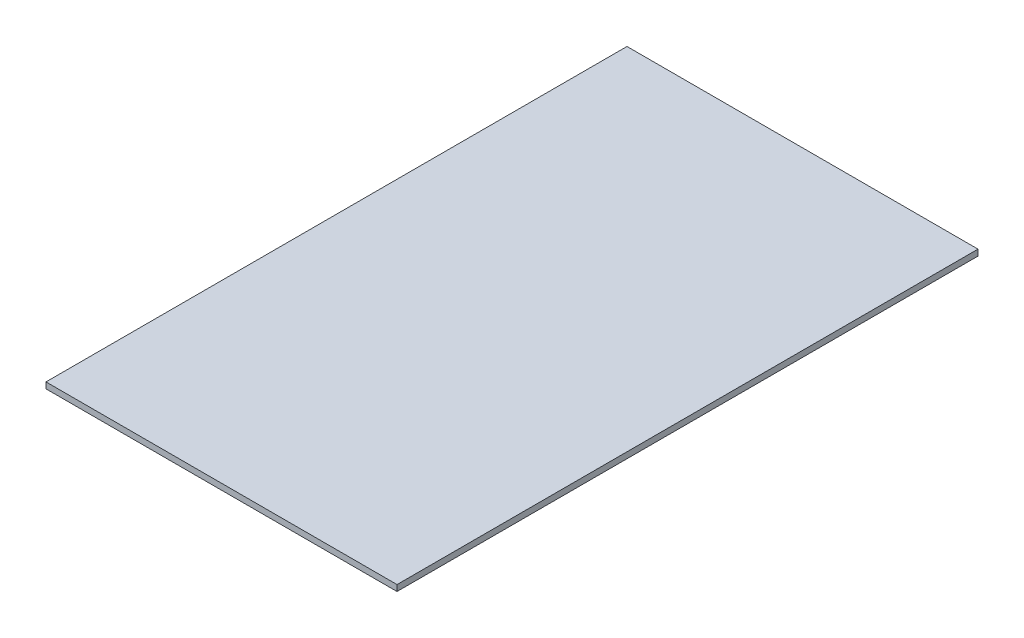
ISO-10303-21;
HEADER;
FILE_DESCRIPTION(('STEP AP214'),'2;1');
FILE_NAME('part.step','',(''),(''),'','','');
FILE_SCHEMA(('AUTOMOTIVE_DESIGN { 1 0 10303 214 1 1 1 1 }'));
ENDSEC;
DATA;
#1=APPLICATION_CONTEXT('core data for automotive mechanical design processes');
#2=APPLICATION_PROTOCOL_DEFINITION('international standard','automotive_design',2000,#1);
#3=PRODUCT_CONTEXT('',#1,'mechanical');
#4=PRODUCT('Part','Part','',(#3));
#5=PRODUCT_RELATED_PRODUCT_CATEGORY('part','',(#4));
#6=PRODUCT_DEFINITION_FORMATION('','',#4);
#7=PRODUCT_DEFINITION_CONTEXT('part definition',#1,'design');
#8=PRODUCT_DEFINITION('design','',#6,#7);
#9=PRODUCT_DEFINITION_SHAPE('','',#8);
#10=(LENGTH_UNIT() NAMED_UNIT(*) SI_UNIT(.MILLI.,.METRE.));
#11=(NAMED_UNIT(*) PLANE_ANGLE_UNIT() SI_UNIT($,.RADIAN.));
#12=(NAMED_UNIT(*) SI_UNIT($,.STERADIAN.) SOLID_ANGLE_UNIT());
#13=UNCERTAINTY_MEASURE_WITH_UNIT(LENGTH_MEASURE(1.E-05),#10,'distance_accuracy_value','');
#14=(GEOMETRIC_REPRESENTATION_CONTEXT(3) GLOBAL_UNCERTAINTY_ASSIGNED_CONTEXT((#13)) GLOBAL_UNIT_ASSIGNED_CONTEXT((#10,
#11,#12)) REPRESENTATION_CONTEXT('',''));
#15=CARTESIAN_POINT('',(0.,0.,0.));
#16=DIRECTION('',(0.,0.,1.));
#17=DIRECTION('',(1.,0.,0.));
#18=AXIS2_PLACEMENT_3D('',#15,#16,#17);
#19=CARTESIAN_POINT('',(0.,3.175,0.));
#20=DIRECTION('',(1.,0.,0.));
#21=DIRECTION('',(0.,0.,-1.));
#22=AXIS2_PLACEMENT_3D('',#19,#20,#21);
#23=PLANE('',#22);
#24=DIRECTION('',(0.,0.,1.));
#25=VECTOR('',#24,1.);
#26=CARTESIAN_POINT('',(0.,0.,0.));
#27=LINE('',#26,#25);
#28=CARTESIAN_POINT('',(0.,0.,-304.8));
#29=VERTEX_POINT('',#28);
#30=CARTESIAN_POINT('',(0.,0.,0.));
#31=VERTEX_POINT('',#30);
#32=EDGE_CURVE('E95',#29,#31,#27,.T.);
#33=ORIENTED_EDGE('',*,*,#32,.T.);
#34=DIRECTION('',(0.,-1.,0.));
#35=VECTOR('',#34,1.);
#36=CARTESIAN_POINT('',(0.,3.175,0.));
#37=LINE('',#36,#35);
#38=CARTESIAN_POINT('',(0.,3.175,0.));
#39=VERTEX_POINT('',#38);
#40=EDGE_CURVE('E11',#39,#31,#37,.T.);
#41=ORIENTED_EDGE('',*,*,#40,.F.);
#42=DIRECTION('',(0.,0.,1.));
#43=VECTOR('',#42,1.);
#44=CARTESIAN_POINT('',(0.,3.175,0.));
#45=LINE('',#44,#43);
#46=CARTESIAN_POINT('',(0.,3.175,-304.8));
#47=VERTEX_POINT('',#46);
#48=EDGE_CURVE('E83',#47,#39,#45,.T.);
#49=ORIENTED_EDGE('',*,*,#48,.F.);
#50=DIRECTION('',(0.,-1.,0.));
#51=VECTOR('',#50,1.);
#52=CARTESIAN_POINT('',(0.,3.175,-304.8));
#53=LINE('',#52,#51);
#54=EDGE_CURVE('E91',#47,#29,#53,.T.);
#55=ORIENTED_EDGE('',*,*,#54,.T.);
#56=EDGE_LOOP('',(#33,#41,#49,#55));
#57=FACE_BOUND('',#56,.T.);
#58=ADVANCED_FACE('F32',(#57),#23,.F.);
#59=CARTESIAN_POINT('',(0.,3.175,0.));
#60=DIRECTION('',(0.,0.,-1.));
#61=DIRECTION('',(-1.,0.,0.));
#62=AXIS2_PLACEMENT_3D('',#59,#60,#61);
#63=PLANE('',#62);
#64=DIRECTION('',(1.,0.,0.));
#65=VECTOR('',#64,1.);
#66=CARTESIAN_POINT('',(0.,0.,0.));
#67=LINE('',#66,#65);
#68=CARTESIAN_POINT('',(184.15,0.,0.));
#69=VERTEX_POINT('',#68);
#70=EDGE_CURVE('E87',#31,#69,#67,.T.);
#71=ORIENTED_EDGE('',*,*,#70,.T.);
#72=DIRECTION('',(0.,-1.,0.));
#73=VECTOR('',#72,1.);
#74=CARTESIAN_POINT('',(184.15,3.175,0.));
#75=LINE('',#74,#73);
#76=CARTESIAN_POINT('',(184.15,3.175,0.));
#77=VERTEX_POINT('',#76);
#78=EDGE_CURVE('E40',#77,#69,#75,.T.);
#79=ORIENTED_EDGE('',*,*,#78,.F.);
#80=DIRECTION('',(1.,0.,0.));
#81=VECTOR('',#80,1.);
#82=CARTESIAN_POINT('',(0.,3.175,0.));
#83=LINE('',#82,#81);
#84=EDGE_CURVE('E78',#39,#77,#83,.T.);
#85=ORIENTED_EDGE('',*,*,#84,.F.);
#86=ORIENTED_EDGE('',*,*,#40,.T.);
#87=EDGE_LOOP('',(#71,#79,#85,#86));
#88=FACE_BOUND('',#87,.T.);
#89=ADVANCED_FACE('F86',(#88),#63,.F.);
#90=CARTESIAN_POINT('',(184.15,3.175,0.));
#91=DIRECTION('',(-1.,0.,0.));
#92=DIRECTION('',(0.,0.,1.));
#93=AXIS2_PLACEMENT_3D('',#90,#91,#92);
#94=PLANE('',#93);
#95=DIRECTION('',(0.,0.,-1.));
#96=VECTOR('',#95,1.);
#97=CARTESIAN_POINT('',(184.15,0.,0.));
#98=LINE('',#97,#96);
#99=CARTESIAN_POINT('',(184.15,0.,-304.8));
#100=VERTEX_POINT('',#99);
#101=EDGE_CURVE('E65',#69,#100,#98,.T.);
#102=ORIENTED_EDGE('',*,*,#101,.T.);
#103=DIRECTION('',(0.,-1.,0.));
#104=VECTOR('',#103,1.);
#105=CARTESIAN_POINT('',(184.15,3.175,-304.8));
#106=LINE('',#105,#104);
#107=CARTESIAN_POINT('',(184.15,3.175,-304.8));
#108=VERTEX_POINT('',#107);
#109=EDGE_CURVE('E88',#108,#100,#106,.T.);
#110=ORIENTED_EDGE('',*,*,#109,.F.);
#111=DIRECTION('',(0.,0.,-1.));
#112=VECTOR('',#111,1.);
#113=CARTESIAN_POINT('',(184.15,3.175,0.));
#114=LINE('',#113,#112);
#115=EDGE_CURVE('E81',#77,#108,#114,.T.);
#116=ORIENTED_EDGE('',*,*,#115,.F.);
#117=ORIENTED_EDGE('',*,*,#78,.T.);
#118=EDGE_LOOP('',(#102,#110,#116,#117));
#119=FACE_BOUND('',#118,.T.);
#120=ADVANCED_FACE('F89',(#119),#94,.F.);
#121=CARTESIAN_POINT('',(0.,3.175,-304.8));
#122=DIRECTION('',(0.,0.,1.));
#123=DIRECTION('',(1.,0.,0.));
#124=AXIS2_PLACEMENT_3D('',#121,#122,#123);
#125=PLANE('',#124);
#126=DIRECTION('',(-1.,0.,0.));
#127=VECTOR('',#126,1.);
#128=CARTESIAN_POINT('',(0.,0.,-304.8));
#129=LINE('',#128,#127);
#130=EDGE_CURVE('E71',#100,#29,#129,.T.);
#131=ORIENTED_EDGE('',*,*,#130,.T.);
#132=ORIENTED_EDGE('',*,*,#54,.F.);
#133=DIRECTION('',(-1.,0.,0.));
#134=VECTOR('',#133,1.);
#135=CARTESIAN_POINT('',(0.,3.175,-304.8));
#136=LINE('',#135,#134);
#137=EDGE_CURVE('E48',#108,#47,#136,.T.);
#138=ORIENTED_EDGE('',*,*,#137,.F.);
#139=ORIENTED_EDGE('',*,*,#109,.T.);
#140=EDGE_LOOP('',(#131,#132,#138,#139));
#141=FACE_BOUND('',#140,.T.);
#142=ADVANCED_FACE('F102',(#141),#125,.F.);
#143=CARTESIAN_POINT('',(0.,3.175,0.));
#144=DIRECTION('',(0.,-1.,0.));
#145=DIRECTION('',(0.,0.,-1.));
#146=AXIS2_PLACEMENT_3D('',#143,#144,#145);
#147=PLANE('',#146);
#148=ORIENTED_EDGE('',*,*,#48,.T.);
#149=ORIENTED_EDGE('',*,*,#84,.T.);
#150=ORIENTED_EDGE('',*,*,#115,.T.);
#151=ORIENTED_EDGE('',*,*,#137,.T.);
#152=EDGE_LOOP('',(#148,#149,#150,#151));
#153=FACE_BOUND('',#152,.T.);
#154=ADVANCED_FACE('F79',(#153),#147,.F.);
#155=CARTESIAN_POINT('',(0.,0.,0.));
#156=DIRECTION('',(0.,-1.,0.));
#157=DIRECTION('',(0.,0.,-1.));
#158=AXIS2_PLACEMENT_3D('',#155,#156,#157);
#159=PLANE('',#158);
#160=ORIENTED_EDGE('',*,*,#32,.F.);
#161=ORIENTED_EDGE('',*,*,#130,.F.);
#162=ORIENTED_EDGE('',*,*,#101,.F.);
#163=ORIENTED_EDGE('',*,*,#70,.F.);
#164=EDGE_LOOP('',(#160,#161,#162,#163));
#165=FACE_BOUND('',#164,.T.);
#166=ADVANCED_FACE('F105',(#165),#159,.T.);
#167=CLOSED_SHELL('',(#58,#89,#120,#142,#154,#166));
#168=MANIFOLD_SOLID_BREP('B2',#167);
#169=ADVANCED_BREP_SHAPE_REPRESENTATION('',(#18,#168),#14);
#170=SHAPE_DEFINITION_REPRESENTATION(#9,#169);
ENDSEC;
END-ISO-10303-21;
